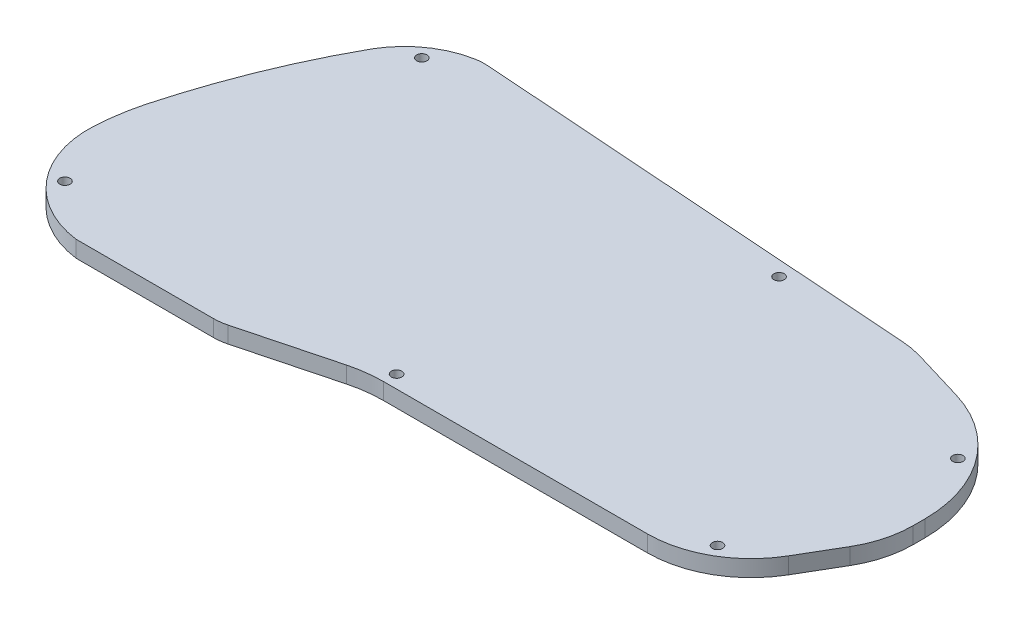
ISO-10303-21;
HEADER;
FILE_DESCRIPTION(('STEP AP214'),'2;1');
FILE_NAME('part.step','',(''),(''),'','','');
FILE_SCHEMA(('AUTOMOTIVE_DESIGN { 1 0 10303 214 1 1 1 1 }'));
ENDSEC;
DATA;
#1=APPLICATION_CONTEXT('core data for automotive mechanical design processes');
#2=APPLICATION_PROTOCOL_DEFINITION('international standard','automotive_design',2000,#1);
#3=PRODUCT_CONTEXT('',#1,'mechanical');
#4=PRODUCT('Part','Part','',(#3));
#5=PRODUCT_RELATED_PRODUCT_CATEGORY('part','',(#4));
#6=PRODUCT_DEFINITION_FORMATION('','',#4);
#7=PRODUCT_DEFINITION_CONTEXT('part definition',#1,'design');
#8=PRODUCT_DEFINITION('design','',#6,#7);
#9=PRODUCT_DEFINITION_SHAPE('','',#8);
#10=(LENGTH_UNIT() NAMED_UNIT(*) SI_UNIT(.MILLI.,.METRE.));
#11=(NAMED_UNIT(*) PLANE_ANGLE_UNIT() SI_UNIT($,.RADIAN.));
#12=(NAMED_UNIT(*) SI_UNIT($,.STERADIAN.) SOLID_ANGLE_UNIT());
#13=UNCERTAINTY_MEASURE_WITH_UNIT(LENGTH_MEASURE(1.E-05),#10,'distance_accuracy_value','');
#14=(GEOMETRIC_REPRESENTATION_CONTEXT(3) GLOBAL_UNCERTAINTY_ASSIGNED_CONTEXT((#13)) GLOBAL_UNIT_ASSIGNED_CONTEXT((#10,
#11,#12)) REPRESENTATION_CONTEXT('',''));
#15=CARTESIAN_POINT('',(0.,0.,0.));
#16=DIRECTION('',(0.,0.,1.));
#17=DIRECTION('',(1.,0.,0.));
#18=AXIS2_PLACEMENT_3D('',#15,#16,#17);
#19=CARTESIAN_POINT('',(-176.887501396103,3.175,27.0431588011881));
#20=DIRECTION('',(0.,1.,0.));
#21=DIRECTION('',(0.,0.,1.));
#22=AXIS2_PLACEMENT_3D('',#19,#20,#21);
#23=PLANE('',#22);
#24=CARTESIAN_POINT('',(-190.160816790515,3.175,37.9709577176414));
#25=DIRECTION('',(0.,1.,0.));
#26=DIRECTION('',(0.,0.,1.));
#27=AXIS2_PLACEMENT_3D('',#24,#25,#26);
#28=CIRCLE('',#27,0.999999999999998);
#29=CARTESIAN_POINT('',(-190.160816790515,3.175,38.9709577176414));
#30=VERTEX_POINT('',#29);
#31=EDGE_CURVE('E464',#30,#30,#28,.T.);
#32=ORIENTED_EDGE('',*,*,#31,.F.);
#33=EDGE_LOOP('',(#32));
#34=FACE_BOUND('',#33,.T.);
#35=CARTESIAN_POINT('',(-105.433568659323,3.175,-14.889534132338));
#36=DIRECTION('',(0.,1.,0.));
#37=DIRECTION('',(0.,0.,1.));
#38=AXIS2_PLACEMENT_3D('',#35,#36,#37);
#39=CIRCLE('',#38,0.999999999999998);
#40=CARTESIAN_POINT('',(-105.433568659323,3.175,-13.889534132338));
#41=VERTEX_POINT('',#40);
#42=EDGE_CURVE('E476',#41,#41,#39,.T.);
#43=ORIENTED_EDGE('',*,*,#42,.F.);
#44=EDGE_LOOP('',(#43));
#45=FACE_BOUND('',#44,.T.);
#46=CARTESIAN_POINT('',(-66.5223487505901,3.175,35.8827361446802));
#47=DIRECTION('',(0.,1.,0.));
#48=DIRECTION('',(0.,0.,1.));
#49=AXIS2_PLACEMENT_3D('',#46,#47,#48);
#50=CIRCLE('',#49,0.999999999999998);
#51=CARTESIAN_POINT('',(-66.5223487505901,3.175,36.8827361446802));
#52=VERTEX_POINT('',#51);
#53=EDGE_CURVE('E338',#52,#52,#50,.T.);
#54=ORIENTED_EDGE('',*,*,#53,.F.);
#55=EDGE_LOOP('',(#54));
#56=FACE_BOUND('',#55,.T.);
#57=CARTESIAN_POINT('',(-176.887501396103,3.175,27.0431588011881));
#58=DIRECTION('',(0.,1.,0.));
#59=DIRECTION('',(0.,0.,1.));
#60=AXIS2_PLACEMENT_3D('',#57,#58,#59);
#61=CIRCLE('',#60,19.6931671994012);
#62=CARTESIAN_POINT('',(-196.548238057197,3.175,25.9134383549433));
#63=VERTEX_POINT('',#62);
#64=CARTESIAN_POINT('',(-179.386599243487,3.175,46.5771124279573));
#65=VERTEX_POINT('',#64);
#66=EDGE_CURVE('E334',#63,#65,#61,.T.);
#67=ORIENTED_EDGE('',*,*,#66,.T.);
#68=DIRECTION('',(1.,0.,0.));
#69=VECTOR('',#68,1.);
#70=CARTESIAN_POINT('',(-179.386599243487,3.175,46.5771124279573));
#71=LINE('',#70,#69);
#72=CARTESIAN_POINT('',(-152.973973641168,3.175,46.5771124279573));
#73=VERTEX_POINT('',#72);
#74=EDGE_CURVE('E126',#65,#73,#71,.T.);
#75=ORIENTED_EDGE('',*,*,#74,.T.);
#76=CARTESIAN_POINT('',(-152.973973641168,3.175,36.5771124279573));
#77=DIRECTION('',(0.,1.,0.));
#78=DIRECTION('',(0.,0.,1.));
#79=AXIS2_PLACEMENT_3D('',#76,#77,#78);
#80=CIRCLE('',#79,9.99999999999999);
#81=CARTESIAN_POINT('',(-150.440219102114,3.175,46.2507925930146));
#82=VERTEX_POINT('',#81);
#83=EDGE_CURVE('E287',#73,#82,#80,.T.);
#84=ORIENTED_EDGE('',*,*,#83,.T.);
#85=DIRECTION('',(0.967368016505734,0.,-0.253375453905388));
#86=VECTOR('',#85,1.);
#87=CARTESIAN_POINT('',(-150.440219102114,3.175,46.2507925930146));
#88=LINE('',#87,#86);
#89=CARTESIAN_POINT('',(-132.369306257302,3.175,41.5176138374486));
#90=VERTEX_POINT('',#89);
#91=EDGE_CURVE('E354',#82,#90,#88,.T.);
#92=ORIENTED_EDGE('',*,*,#91,.T.);
#93=CARTESIAN_POINT('',(-126.034919909668,3.175,65.701814250092));
#94=DIRECTION('',(0.,-1.,0.));
#95=DIRECTION('',(0.,0.,1.));
#96=AXIS2_PLACEMENT_3D('',#93,#94,#95);
#97=CIRCLE('',#96,25.);
#98=CARTESIAN_POINT('',(-126.034919909668,3.175,40.7018142500919));
#99=VERTEX_POINT('',#98);
#100=EDGE_CURVE('E356',#90,#99,#97,.T.);
#101=ORIENTED_EDGE('',*,*,#100,.T.);
#102=DIRECTION('',(1.,0.,0.));
#103=VECTOR('',#102,1.);
#104=CARTESIAN_POINT('',(-126.034919909668,3.175,40.7018142500919));
#105=LINE('',#104,#103);
#106=CARTESIAN_POINT('',(-75.2280716057246,3.175,40.7018142500919));
#107=VERTEX_POINT('',#106);
#108=EDGE_CURVE('E358',#99,#107,#105,.T.);
#109=ORIENTED_EDGE('',*,*,#108,.T.);
#110=CARTESIAN_POINT('',(-75.2280716057246,3.175,20.7018142500919));
#111=DIRECTION('',(0.,1.,0.));
#112=DIRECTION('',(0.,0.,1.));
#113=AXIS2_PLACEMENT_3D('',#110,#111,#112);
#114=CIRCLE('',#113,20.);
#115=CARTESIAN_POINT('',(-57.9662399388212,3.175,30.8027630918342));
#116=VERTEX_POINT('',#115);
#117=EDGE_CURVE('E360',#107,#116,#114,.T.);
#118=ORIENTED_EDGE('',*,*,#117,.T.);
#119=DIRECTION('',(0.505047442087112,0.,-0.863091583345166));
#120=VECTOR('',#119,1.);
#121=CARTESIAN_POINT('',(-57.9662399388212,3.175,30.8027630918342));
#122=LINE('',#121,#120);
#123=CARTESIAN_POINT('',(-53.5819786402493,3.175,23.3103599814533));
#124=VERTEX_POINT('',#123);
#125=EDGE_CURVE('E362',#116,#124,#122,.T.);
#126=ORIENTED_EDGE('',*,*,#125,.T.);
#127=CARTESIAN_POINT('',(-69.9807187238073,3.175,13.714458581798));
#128=DIRECTION('',(0.,1.,0.));
#129=DIRECTION('',(0.,0.,1.));
#130=AXIS2_PLACEMENT_3D('',#127,#128,#129);
#131=CIRCLE('',#130,19.);
#132=CARTESIAN_POINT('',(-50.9807187238073,3.175,13.7144585817979));
#133=VERTEX_POINT('',#132);
#134=EDGE_CURVE('E364',#124,#133,#131,.T.);
#135=ORIENTED_EDGE('',*,*,#134,.T.);
#136=DIRECTION('',(0.,0.,-1.));
#137=VECTOR('',#136,1.);
#138=CARTESIAN_POINT('',(-50.9807187238073,3.175,13.7144585817979));
#139=LINE('',#138,#137);
#140=CARTESIAN_POINT('',(-50.9807187238073,3.175,11.4807206153286));
#141=VERTEX_POINT('',#140);
#142=EDGE_CURVE('E366',#133,#141,#139,.T.);
#143=ORIENTED_EDGE('',*,*,#142,.T.);
#144=CARTESIAN_POINT('',(-75.7101213146076,3.175,11.4807206153286));
#145=DIRECTION('',(0.,1.,0.));
#146=DIRECTION('',(0.,0.,1.));
#147=AXIS2_PLACEMENT_3D('',#144,#145,#146);
#148=CIRCLE('',#147,24.7294025908002);
#149=CARTESIAN_POINT('',(-68.6114430648658,3.175,-12.2079289790345));
#150=VERTEX_POINT('',#149);
#151=EDGE_CURVE('E367',#141,#150,#148,.T.);
#152=ORIENTED_EDGE('',*,*,#151,.T.);
#153=DIRECTION('',(-0.957914349422078,0.,-0.287054174627851));
#154=VECTOR('',#153,1.);
#155=CARTESIAN_POINT('',(-68.6114430648658,3.175,-12.2079289790344));
#156=LINE('',#155,#154);
#157=CARTESIAN_POINT('',(-77.2873572168255,3.175,-14.8078037773767));
#158=VERTEX_POINT('',#157);
#159=EDGE_CURVE('E229',#150,#158,#156,.T.);
#160=ORIENTED_EDGE('',*,*,#159,.T.);
#161=CARTESIAN_POINT('',(-77.2873572168255,3.175,-14.8078037773767));
#162=CARTESIAN_POINT('',(-78.602908240201,3.175,-15.2606179843804));
#163=CARTESIAN_POINT('',(-80.4963343847827,3.175,-15.6623896751234));
#164=CARTESIAN_POINT('',(-81.330596094362,3.175,-15.7967280517116));
#165=CARTESIAN_POINT('',(-81.9124474631906,3.175,-15.8723829859845));
#166=CARTESIAN_POINT('',(-82.2021378739723,3.175,-15.9030949784528));
#167=CARTESIAN_POINT('',(-82.5582741713018,3.175,-15.9393677883881));
#168=CARTESIAN_POINT('',(-82.8699419030708,3.175,-15.9614492051122));
#169=B_SPLINE_CURVE_WITH_KNOTS('',2,(#161,#162,#163,#164,#165,#166,#167,#168),.UNSPECIFIED.,.F.,
.F.,(3,1,1,1,1,1,3),(0.680418274569865,0.836668274569865,0.899168274569865,0.93513949616634,
0.961668274569865,0.96638949616634,1.),.UNSPECIFIED.);
#170=CARTESIAN_POINT('',(-82.8699419030708,3.175,-15.9614492051122));
#171=VERTEX_POINT('',#170);
#172=EDGE_CURVE('E222',#158,#171,#169,.T.);
#173=ORIENTED_EDGE('',*,*,#172,.T.);
#174=DIRECTION('',(-0.997499603118509,0.,-0.0706720721248309));
#175=VECTOR('',#174,1.);
#176=CARTESIAN_POINT('',(-82.8699419030708,3.175,-15.9614492051122));
#177=LINE('',#176,#175);
#178=CARTESIAN_POINT('',(-168.58559921142,3.175,-22.0343369502147));
#179=VERTEX_POINT('',#178);
#180=EDGE_CURVE('E228',#171,#179,#177,.T.);
#181=ORIENTED_EDGE('',*,*,#180,.T.);
#182=CARTESIAN_POINT('',(-169.292319932669,3.175,-12.0593409190296));
#183=DIRECTION('',(0.,1.,0.));
#184=DIRECTION('',(0.,0.,1.));
#185=AXIS2_PLACEMENT_3D('',#182,#183,#184);
#186=CIRCLE('',#185,9.99999999999999);
#187=CARTESIAN_POINT('',(-171.220569819136,3.175,-21.8716725672841));
#188=VERTEX_POINT('',#187);
#189=EDGE_CURVE('E175',#179,#188,#186,.T.);
#190=ORIENTED_EDGE('',*,*,#189,.T.);
#191=CARTESIAN_POINT('',(-167.942545012141,3.175,-5.19070876525153));
#192=DIRECTION('',(0.,1.,0.));
#193=DIRECTION('',(0.,0.,1.));
#194=AXIS2_PLACEMENT_3D('',#191,#192,#193);
#195=CIRCLE('',#194,16.9999999999999);
#196=CARTESIAN_POINT('',(-182.649967907516,3.175,-13.7166522190047));
#197=VERTEX_POINT('',#196);
#198=EDGE_CURVE('E169',#188,#197,#195,.T.);
#199=ORIENTED_EDGE('',*,*,#198,.T.);
#200=CARTESIAN_POINT('',(-182.649967907516,3.175,-13.7166522190045));
#201=CARTESIAN_POINT('',(-184.020157032035,3.175,-11.2666043813432));
#202=CARTESIAN_POINT('',(-186.595532539657,3.175,-6.27098095210053));
#203=CARTESIAN_POINT('',(-189.97373902629,3.175,1.44231799896356));
#204=CARTESIAN_POINT('',(-192.877518679826,3.175,9.36730535737206));
#205=CARTESIAN_POINT('',(-194.495666875214,3.175,14.743968326978));
#206=CARTESIAN_POINT('',(-195.23346346214,3.175,17.4525071102284));
#207=B_SPLINE_CURVE_WITH_KNOTS('',3,(#200,#201,#202,#203,#204,#205,#206),.UNSPECIFIED.,.F.,.F.,
(4,1,1,1,4),(0.255798805589508,0.412929873190249,0.570060940790989,0.72719200839173,
0.88432307599247),.UNSPECIFIED.);
#208=CARTESIAN_POINT('',(-195.23346346214,3.175,17.4525071102284));
#209=VERTEX_POINT('',#208);
#210=EDGE_CURVE('E173',#197,#209,#207,.T.);
#211=ORIENTED_EDGE('',*,*,#210,.T.);
#212=CARTESIAN_POINT('',(-152.307528877601,3.175,28.455542172216));
#213=DIRECTION('',(0.,1.,0.));
#214=DIRECTION('',(0.,0.,1.));
#215=AXIS2_PLACEMENT_3D('',#212,#213,#214);
#216=CIRCLE('',#215,44.3136845740843);
#217=EDGE_CURVE('E53',#209,#63,#216,.T.);
#218=ORIENTED_EDGE('',*,*,#217,.T.);
#219=EDGE_LOOP('',(#67,#75,#84,#92,#101,#109,#118,#126,#135,#143,#152,#160,#173,#181,#190,#199,
#211,#218));
#220=FACE_BOUND('',#219,.T.);
#221=CARTESIAN_POINT('',(-57.8776634191434,3.175,-1.79142257823171));
#222=DIRECTION('',(0.,1.,0.));
#223=DIRECTION('',(0.,0.,1.));
#224=AXIS2_PLACEMENT_3D('',#221,#222,#223);
#225=CIRCLE('',#224,0.999999999999998);
#226=CARTESIAN_POINT('',(-57.8776634191434,3.175,-0.791422578231715));
#227=VERTEX_POINT('',#226);
#228=EDGE_CURVE('E345',#227,#227,#225,.T.);
#229=ORIENTED_EDGE('',*,*,#228,.F.);
#230=EDGE_LOOP('',(#229));
#231=FACE_BOUND('',#230,.T.);
#232=CARTESIAN_POINT('',(-176.364455759612,3.175,-16.9941582340143));
#233=DIRECTION('',(0.,1.,0.));
#234=DIRECTION('',(0.,0.,1.));
#235=AXIS2_PLACEMENT_3D('',#232,#233,#234);
#236=CIRCLE('',#235,0.999999999999998);
#237=CARTESIAN_POINT('',(-176.364455759612,3.175,-15.9941582340143));
#238=VERTEX_POINT('',#237);
#239=EDGE_CURVE('E470',#238,#238,#236,.T.);
#240=ORIENTED_EDGE('',*,*,#239,.F.);
#241=EDGE_LOOP('',(#240));
#242=FACE_BOUND('',#241,.T.);
#243=CARTESIAN_POINT('',(-126.034919909668,3.175,38.2018142500919));
#244=DIRECTION('',(0.,1.,0.));
#245=DIRECTION('',(0.,0.,1.));
#246=AXIS2_PLACEMENT_3D('',#243,#244,#245);
#247=CIRCLE('',#246,0.999999999999998);
#248=CARTESIAN_POINT('',(-126.034919909668,3.175,39.2018142500919));
#249=VERTEX_POINT('',#248);
#250=EDGE_CURVE('E455',#249,#249,#247,.T.);
#251=ORIENTED_EDGE('',*,*,#250,.F.);
#252=EDGE_LOOP('',(#251));
#253=FACE_BOUND('',#252,.T.);
#254=ADVANCED_FACE('F36',(#34,#45,#56,#220,#231,#242,#253),#23,.T.);
#255=CARTESIAN_POINT('',(-176.887501396103,0.,27.0431588011881));
#256=DIRECTION('',(0.,1.,0.));
#257=DIRECTION('',(0.,0.,1.));
#258=AXIS2_PLACEMENT_3D('',#255,#256,#257);
#259=PLANE('',#258);
#260=CARTESIAN_POINT('',(-176.887501396103,0.,27.0431588011881));
#261=DIRECTION('',(0.,1.,0.));
#262=DIRECTION('',(0.,0.,1.));
#263=AXIS2_PLACEMENT_3D('',#260,#261,#262);
#264=CIRCLE('',#263,19.6931671994012);
#265=CARTESIAN_POINT('',(-196.548238057197,0.,25.9134383549433));
#266=VERTEX_POINT('',#265);
#267=CARTESIAN_POINT('',(-179.386599243487,0.,46.5771124279573));
#268=VERTEX_POINT('',#267);
#269=EDGE_CURVE('E299',#266,#268,#264,.T.);
#270=ORIENTED_EDGE('',*,*,#269,.F.);
#271=CARTESIAN_POINT('',(-152.307528877601,0.,28.455542172216));
#272=DIRECTION('',(0.,1.,0.));
#273=DIRECTION('',(0.,0.,1.));
#274=AXIS2_PLACEMENT_3D('',#271,#272,#273);
#275=CIRCLE('',#274,44.3136845740843);
#276=CARTESIAN_POINT('',(-195.23346346214,0.,17.4525071102284));
#277=VERTEX_POINT('',#276);
#278=EDGE_CURVE('E118',#277,#266,#275,.T.);
#279=ORIENTED_EDGE('',*,*,#278,.F.);
#280=CARTESIAN_POINT('',(-182.649967907516,0.,-13.7166522190045));
#281=CARTESIAN_POINT('',(-184.020157032035,0.,-11.2666043813432));
#282=CARTESIAN_POINT('',(-186.595532539657,0.,-6.27098095210053));
#283=CARTESIAN_POINT('',(-189.97373902629,0.,1.44231799896356));
#284=CARTESIAN_POINT('',(-192.877518679826,0.,9.36730535737206));
#285=CARTESIAN_POINT('',(-194.495666875214,0.,14.743968326978));
#286=CARTESIAN_POINT('',(-195.23346346214,0.,17.4525071102284));
#287=B_SPLINE_CURVE_WITH_KNOTS('',3,(#280,#281,#282,#283,#284,#285,#286),.UNSPECIFIED.,.F.,.F.,
(4,1,1,1,4),(0.255798805589508,0.412929873190249,0.570060940790989,0.72719200839173,
0.88432307599247),.UNSPECIFIED.);
#288=CARTESIAN_POINT('',(-182.649967907516,0.,-13.7166522190047));
#289=VERTEX_POINT('',#288);
#290=EDGE_CURVE('E112',#289,#277,#287,.T.);
#291=ORIENTED_EDGE('',*,*,#290,.F.);
#292=CARTESIAN_POINT('',(-167.942545012141,0.,-5.19070876525153));
#293=DIRECTION('',(0.,1.,0.));
#294=DIRECTION('',(0.,0.,1.));
#295=AXIS2_PLACEMENT_3D('',#292,#293,#294);
#296=CIRCLE('',#295,16.9999999999999);
#297=CARTESIAN_POINT('',(-171.220569819136,0.,-21.8716725672841));
#298=VERTEX_POINT('',#297);
#299=EDGE_CURVE('E183',#298,#289,#296,.T.);
#300=ORIENTED_EDGE('',*,*,#299,.F.);
#301=CARTESIAN_POINT('',(-169.292319932669,0.,-12.0593409190296));
#302=DIRECTION('',(0.,1.,0.));
#303=DIRECTION('',(0.,0.,1.));
#304=AXIS2_PLACEMENT_3D('',#301,#302,#303);
#305=CIRCLE('',#304,9.99999999999999);
#306=CARTESIAN_POINT('',(-168.58559921142,0.,-22.0343369502147));
#307=VERTEX_POINT('',#306);
#308=EDGE_CURVE('E246',#307,#298,#305,.T.);
#309=ORIENTED_EDGE('',*,*,#308,.F.);
#310=DIRECTION('',(-0.997499603118509,0.,-0.0706720721248309));
#311=VECTOR('',#310,1.);
#312=CARTESIAN_POINT('',(-82.8699419030708,0.,-15.9614492051122));
#313=LINE('',#312,#311);
#314=CARTESIAN_POINT('',(-82.8699419030708,0.,-15.9614492051122));
#315=VERTEX_POINT('',#314);
#316=EDGE_CURVE('E242',#315,#307,#313,.T.);
#317=ORIENTED_EDGE('',*,*,#316,.F.);
#318=CARTESIAN_POINT('',(-77.2873572168255,0.,-14.8078037773767));
#319=CARTESIAN_POINT('',(-78.602908240201,0.,-15.2606179843804));
#320=CARTESIAN_POINT('',(-80.4963343847827,0.,-15.6623896751234));
#321=CARTESIAN_POINT('',(-81.330596094362,0.,-15.7967280517116));
#322=CARTESIAN_POINT('',(-81.9124474631906,0.,-15.8723829859845));
#323=CARTESIAN_POINT('',(-82.2021378739723,0.,-15.9030949784528));
#324=CARTESIAN_POINT('',(-82.5582741713018,0.,-15.9393677883881));
#325=CARTESIAN_POINT('',(-82.8699419030708,0.,-15.9614492051122));
#326=B_SPLINE_CURVE_WITH_KNOTS('',2,(#318,#319,#320,#321,#322,#323,#324,#325),.UNSPECIFIED.,.F.,
.F.,(3,1,1,1,1,1,3),(0.680418274569865,0.836668274569865,0.899168274569865,0.93513949616634,
0.961668274569865,0.96638949616634,1.),.UNSPECIFIED.);
#327=CARTESIAN_POINT('',(-77.2873572168255,0.,-14.8078037773767));
#328=VERTEX_POINT('',#327);
#329=EDGE_CURVE('E317',#328,#315,#326,.T.);
#330=ORIENTED_EDGE('',*,*,#329,.F.);
#331=DIRECTION('',(-0.957914349422078,0.,-0.287054174627851));
#332=VECTOR('',#331,1.);
#333=CARTESIAN_POINT('',(-68.6114430648658,0.,-12.2079289790344));
#334=LINE('',#333,#332);
#335=CARTESIAN_POINT('',(-68.6114430648658,0.,-12.2079289790345));
#336=VERTEX_POINT('',#335);
#337=EDGE_CURVE('E315',#336,#328,#334,.T.);
#338=ORIENTED_EDGE('',*,*,#337,.F.);
#339=CARTESIAN_POINT('',(-75.7101213146076,0.,11.4807206153286));
#340=DIRECTION('',(0.,1.,0.));
#341=DIRECTION('',(0.,0.,1.));
#342=AXIS2_PLACEMENT_3D('',#339,#340,#341);
#343=CIRCLE('',#342,24.7294025908002);
#344=CARTESIAN_POINT('',(-50.9807187238073,0.,11.4807206153286));
#345=VERTEX_POINT('',#344);
#346=EDGE_CURVE('E313',#345,#336,#343,.T.);
#347=ORIENTED_EDGE('',*,*,#346,.F.);
#348=DIRECTION('',(0.,0.,-1.));
#349=VECTOR('',#348,1.);
#350=CARTESIAN_POINT('',(-50.9807187238073,0.,13.7144585817979));
#351=LINE('',#350,#349);
#352=CARTESIAN_POINT('',(-50.9807187238073,0.,13.7144585817979));
#353=VERTEX_POINT('',#352);
#354=EDGE_CURVE('E311',#353,#345,#351,.T.);
#355=ORIENTED_EDGE('',*,*,#354,.F.);
#356=CARTESIAN_POINT('',(-69.9807187238073,0.,13.714458581798));
#357=DIRECTION('',(0.,1.,0.));
#358=DIRECTION('',(0.,0.,1.));
#359=AXIS2_PLACEMENT_3D('',#356,#357,#358);
#360=CIRCLE('',#359,19.);
#361=CARTESIAN_POINT('',(-53.5819786402493,0.,23.3103599814533));
#362=VERTEX_POINT('',#361);
#363=EDGE_CURVE('E309',#362,#353,#360,.T.);
#364=ORIENTED_EDGE('',*,*,#363,.F.);
#365=DIRECTION('',(0.505047442087112,0.,-0.863091583345166));
#366=VECTOR('',#365,1.);
#367=CARTESIAN_POINT('',(-57.9662399388212,0.,30.8027630918342));
#368=LINE('',#367,#366);
#369=CARTESIAN_POINT('',(-57.9662399388212,0.,30.8027630918342));
#370=VERTEX_POINT('',#369);
#371=EDGE_CURVE('E307',#370,#362,#368,.T.);
#372=ORIENTED_EDGE('',*,*,#371,.F.);
#373=CARTESIAN_POINT('',(-75.2280716057246,0.,20.7018142500919));
#374=DIRECTION('',(0.,1.,0.));
#375=DIRECTION('',(0.,0.,1.));
#376=AXIS2_PLACEMENT_3D('',#373,#374,#375);
#377=CIRCLE('',#376,20.);
#378=CARTESIAN_POINT('',(-75.2280716057246,0.,40.7018142500919));
#379=VERTEX_POINT('',#378);
#380=EDGE_CURVE('E305',#379,#370,#377,.T.);
#381=ORIENTED_EDGE('',*,*,#380,.F.);
#382=DIRECTION('',(1.,0.,0.));
#383=VECTOR('',#382,1.);
#384=CARTESIAN_POINT('',(-126.034919909668,0.,40.7018142500919));
#385=LINE('',#384,#383);
#386=CARTESIAN_POINT('',(-126.034919909668,0.,40.7018142500919));
#387=VERTEX_POINT('',#386);
#388=EDGE_CURVE('E303',#387,#379,#385,.T.);
#389=ORIENTED_EDGE('',*,*,#388,.F.);
#390=CARTESIAN_POINT('',(-126.034919909668,0.,65.701814250092));
#391=DIRECTION('',(0.,-1.,0.));
#392=DIRECTION('',(0.,0.,1.));
#393=AXIS2_PLACEMENT_3D('',#390,#391,#392);
#394=CIRCLE('',#393,25.);
#395=CARTESIAN_POINT('',(-132.369306257302,0.,41.5176138374486));
#396=VERTEX_POINT('',#395);
#397=EDGE_CURVE('E297',#396,#387,#394,.T.);
#398=ORIENTED_EDGE('',*,*,#397,.F.);
#399=DIRECTION('',(0.967368016505734,0.,-0.253375453905388));
#400=VECTOR('',#399,1.);
#401=CARTESIAN_POINT('',(-150.440219102114,0.,46.2507925930146));
#402=LINE('',#401,#400);
#403=CARTESIAN_POINT('',(-150.440219102114,0.,46.2507925930146));
#404=VERTEX_POINT('',#403);
#405=EDGE_CURVE('E295',#404,#396,#402,.T.);
#406=ORIENTED_EDGE('',*,*,#405,.F.);
#407=CARTESIAN_POINT('',(-152.973973641168,0.,36.5771124279573));
#408=DIRECTION('',(0.,1.,0.));
#409=DIRECTION('',(0.,0.,1.));
#410=AXIS2_PLACEMENT_3D('',#407,#408,#409);
#411=CIRCLE('',#410,9.99999999999999);
#412=CARTESIAN_POINT('',(-152.973973641168,0.,46.5771124279573));
#413=VERTEX_POINT('',#412);
#414=EDGE_CURVE('E286',#413,#404,#411,.T.);
#415=ORIENTED_EDGE('',*,*,#414,.F.);
#416=DIRECTION('',(1.,0.,0.));
#417=VECTOR('',#416,1.);
#418=CARTESIAN_POINT('',(-179.386599243487,0.,46.5771124279573));
#419=LINE('',#418,#417);
#420=EDGE_CURVE('E293',#268,#413,#419,.T.);
#421=ORIENTED_EDGE('',*,*,#420,.F.);
#422=EDGE_LOOP('',(#270,#279,#291,#300,#309,#317,#330,#338,#347,#355,#364,#372,#381,#389,#398,
#406,#415,#421));
#423=FACE_BOUND('',#422,.T.);
#424=CARTESIAN_POINT('',(-66.5223487505901,0.,35.8827361446802));
#425=DIRECTION('',(0.,1.,0.));
#426=DIRECTION('',(0.,0.,1.));
#427=AXIS2_PLACEMENT_3D('',#424,#425,#426);
#428=CIRCLE('',#427,0.999999999999998);
#429=CARTESIAN_POINT('',(-66.5223487505901,0.,36.8827361446802));
#430=VERTEX_POINT('',#429);
#431=EDGE_CURVE('E340',#430,#430,#428,.T.);
#432=ORIENTED_EDGE('',*,*,#431,.T.);
#433=EDGE_LOOP('',(#432));
#434=FACE_BOUND('',#433,.T.);
#435=CARTESIAN_POINT('',(-57.8776634191434,0.,-1.79142257823171));
#436=DIRECTION('',(0.,1.,0.));
#437=DIRECTION('',(0.,0.,1.));
#438=AXIS2_PLACEMENT_3D('',#435,#436,#437);
#439=CIRCLE('',#438,0.999999999999998);
#440=CARTESIAN_POINT('',(-57.8776634191434,0.,-0.791422578231715));
#441=VERTEX_POINT('',#440);
#442=EDGE_CURVE('E348',#441,#441,#439,.T.);
#443=ORIENTED_EDGE('',*,*,#442,.T.);
#444=EDGE_LOOP('',(#443));
#445=FACE_BOUND('',#444,.T.);
#446=CARTESIAN_POINT('',(-105.433568659323,0.,-14.889534132338));
#447=DIRECTION('',(0.,1.,0.));
#448=DIRECTION('',(0.,0.,1.));
#449=AXIS2_PLACEMENT_3D('',#446,#447,#448);
#450=CIRCLE('',#449,0.999999999999998);
#451=CARTESIAN_POINT('',(-105.433568659323,0.,-13.889534132338));
#452=VERTEX_POINT('',#451);
#453=EDGE_CURVE('E473',#452,#452,#450,.T.);
#454=ORIENTED_EDGE('',*,*,#453,.T.);
#455=EDGE_LOOP('',(#454));
#456=FACE_BOUND('',#455,.T.);
#457=CARTESIAN_POINT('',(-176.364455759612,0.,-16.9941582340143));
#458=DIRECTION('',(0.,1.,0.));
#459=DIRECTION('',(0.,0.,1.));
#460=AXIS2_PLACEMENT_3D('',#457,#458,#459);
#461=CIRCLE('',#460,0.999999999999998);
#462=CARTESIAN_POINT('',(-176.364455759612,0.,-15.9941582340143));
#463=VERTEX_POINT('',#462);
#464=EDGE_CURVE('E467',#463,#463,#461,.T.);
#465=ORIENTED_EDGE('',*,*,#464,.T.);
#466=EDGE_LOOP('',(#465));
#467=FACE_BOUND('',#466,.T.);
#468=CARTESIAN_POINT('',(-190.160816790515,0.,37.9709577176414));
#469=DIRECTION('',(0.,1.,0.));
#470=DIRECTION('',(0.,0.,1.));
#471=AXIS2_PLACEMENT_3D('',#468,#469,#470);
#472=CIRCLE('',#471,0.999999999999998);
#473=CARTESIAN_POINT('',(-190.160816790515,0.,38.9709577176414));
#474=VERTEX_POINT('',#473);
#475=EDGE_CURVE('E461',#474,#474,#472,.T.);
#476=ORIENTED_EDGE('',*,*,#475,.T.);
#477=EDGE_LOOP('',(#476));
#478=FACE_BOUND('',#477,.T.);
#479=CARTESIAN_POINT('',(-126.034919909668,0.,38.2018142500919));
#480=DIRECTION('',(0.,1.,0.));
#481=DIRECTION('',(0.,0.,1.));
#482=AXIS2_PLACEMENT_3D('',#479,#480,#481);
#483=CIRCLE('',#482,0.999999999999998);
#484=CARTESIAN_POINT('',(-126.034919909668,0.,39.2018142500919));
#485=VERTEX_POINT('',#484);
#486=EDGE_CURVE('E458',#485,#485,#483,.T.);
#487=ORIENTED_EDGE('',*,*,#486,.T.);
#488=EDGE_LOOP('',(#487));
#489=FACE_BOUND('',#488,.T.);
#490=ADVANCED_FACE('F291',(#423,#434,#445,#456,#467,#478,#489),#259,.F.);
#491=CARTESIAN_POINT('',(-176.887501396103,3.175,27.0431588011881));
#492=DIRECTION('',(0.,-1.,0.));
#493=DIRECTION('',(0.,0.,-1.));
#494=AXIS2_PLACEMENT_3D('',#491,#492,#493);
#495=CYLINDRICAL_SURFACE('',#494,19.6931671994012);
#496=ORIENTED_EDGE('',*,*,#269,.T.);
#497=DIRECTION('',(0.,-1.,0.));
#498=VECTOR('',#497,1.);
#499=CARTESIAN_POINT('',(-179.386599243487,3.175,46.5771124279573));
#500=LINE('',#499,#498);
#501=EDGE_CURVE('E11',#65,#268,#500,.T.);
#502=ORIENTED_EDGE('',*,*,#501,.F.);
#503=ORIENTED_EDGE('',*,*,#66,.F.);
#504=DIRECTION('',(0.,-1.,0.));
#505=VECTOR('',#504,1.);
#506=CARTESIAN_POINT('',(-196.548238057197,3.175,25.9134383549433));
#507=LINE('',#506,#505);
#508=EDGE_CURVE('E189',#63,#266,#507,.T.);
#509=ORIENTED_EDGE('',*,*,#508,.T.);
#510=EDGE_LOOP('',(#496,#502,#503,#509));
#511=FACE_BOUND('',#510,.T.);
#512=ADVANCED_FACE('F38',(#511),#495,.T.);
#513=CARTESIAN_POINT('',(-179.386599243487,3.175,46.5771124279573));
#514=DIRECTION('',(0.,0.,-1.));
#515=DIRECTION('',(-1.,0.,0.));
#516=AXIS2_PLACEMENT_3D('',#513,#514,#515);
#517=PLANE('',#516);
#518=ORIENTED_EDGE('',*,*,#420,.T.);
#519=DIRECTION('',(0.,-1.,0.));
#520=VECTOR('',#519,1.);
#521=CARTESIAN_POINT('',(-152.973973641168,3.175,46.5771124279573));
#522=LINE('',#521,#520);
#523=EDGE_CURVE('E45',#73,#413,#522,.T.);
#524=ORIENTED_EDGE('',*,*,#523,.F.);
#525=ORIENTED_EDGE('',*,*,#74,.F.);
#526=ORIENTED_EDGE('',*,*,#501,.T.);
#527=EDGE_LOOP('',(#518,#524,#525,#526));
#528=FACE_BOUND('',#527,.T.);
#529=ADVANCED_FACE('F412',(#528),#517,.F.);
#530=CARTESIAN_POINT('',(-152.973973641168,3.175,36.5771124279573));
#531=DIRECTION('',(0.,-1.,0.));
#532=DIRECTION('',(0.,0.,-1.));
#533=AXIS2_PLACEMENT_3D('',#530,#531,#532);
#534=CYLINDRICAL_SURFACE('',#533,9.99999999999999);
#535=ORIENTED_EDGE('',*,*,#414,.T.);
#536=DIRECTION('',(0.,-1.,0.));
#537=VECTOR('',#536,1.);
#538=CARTESIAN_POINT('',(-150.440219102114,3.175,46.2507925930146));
#539=LINE('',#538,#537);
#540=EDGE_CURVE('E278',#82,#404,#539,.T.);
#541=ORIENTED_EDGE('',*,*,#540,.F.);
#542=ORIENTED_EDGE('',*,*,#83,.F.);
#543=ORIENTED_EDGE('',*,*,#523,.T.);
#544=EDGE_LOOP('',(#535,#541,#542,#543));
#545=FACE_BOUND('',#544,.T.);
#546=ADVANCED_FACE('F284',(#545),#534,.T.);
#547=CARTESIAN_POINT('',(-150.440219102114,3.175,46.2507925930146));
#548=DIRECTION('',(-0.253375453905388,0.,-0.967368016505734));
#549=DIRECTION('',(-0.967368016505734,0.,0.253375453905388));
#550=AXIS2_PLACEMENT_3D('',#547,#548,#549);
#551=PLANE('',#550);
#552=ORIENTED_EDGE('',*,*,#405,.T.);
#553=DIRECTION('',(0.,-1.,0.));
#554=VECTOR('',#553,1.);
#555=CARTESIAN_POINT('',(-132.369306257302,3.175,41.5176138374486));
#556=LINE('',#555,#554);
#557=EDGE_CURVE('E275',#90,#396,#556,.T.);
#558=ORIENTED_EDGE('',*,*,#557,.F.);
#559=ORIENTED_EDGE('',*,*,#91,.F.);
#560=ORIENTED_EDGE('',*,*,#540,.T.);
#561=EDGE_LOOP('',(#552,#558,#559,#560));
#562=FACE_BOUND('',#561,.T.);
#563=ADVANCED_FACE('F410',(#562),#551,.F.);
#564=CARTESIAN_POINT('',(-126.034919909668,3.175,65.701814250092));
#565=DIRECTION('',(0.,-1.,0.));
#566=DIRECTION('',(0.,0.,-1.));
#567=AXIS2_PLACEMENT_3D('',#564,#565,#566);
#568=CYLINDRICAL_SURFACE('',#567,25.);
#569=ORIENTED_EDGE('',*,*,#397,.T.);
#570=DIRECTION('',(0.,-1.,0.));
#571=VECTOR('',#570,1.);
#572=CARTESIAN_POINT('',(-126.034919909668,3.175,40.7018142500919));
#573=LINE('',#572,#571);
#574=EDGE_CURVE('E272',#99,#387,#573,.T.);
#575=ORIENTED_EDGE('',*,*,#574,.F.);
#576=ORIENTED_EDGE('',*,*,#100,.F.);
#577=ORIENTED_EDGE('',*,*,#557,.T.);
#578=EDGE_LOOP('',(#569,#575,#576,#577));
#579=FACE_BOUND('',#578,.T.);
#580=ADVANCED_FACE('F405',(#579),#568,.F.);
#581=CARTESIAN_POINT('',(-126.034919909668,3.175,40.7018142500919));
#582=DIRECTION('',(0.,0.,-1.));
#583=DIRECTION('',(-1.,0.,0.));
#584=AXIS2_PLACEMENT_3D('',#581,#582,#583);
#585=PLANE('',#584);
#586=ORIENTED_EDGE('',*,*,#388,.T.);
#587=DIRECTION('',(0.,-1.,0.));
#588=VECTOR('',#587,1.);
#589=CARTESIAN_POINT('',(-75.2280716057246,3.175,40.7018142500919));
#590=LINE('',#589,#588);
#591=EDGE_CURVE('E269',#107,#379,#590,.T.);
#592=ORIENTED_EDGE('',*,*,#591,.F.);
#593=ORIENTED_EDGE('',*,*,#108,.F.);
#594=ORIENTED_EDGE('',*,*,#574,.T.);
#595=EDGE_LOOP('',(#586,#592,#593,#594));
#596=FACE_BOUND('',#595,.T.);
#597=ADVANCED_FACE('F402',(#596),#585,.F.);
#598=CARTESIAN_POINT('',(-75.2280716057246,3.175,20.7018142500919));
#599=DIRECTION('',(0.,-1.,0.));
#600=DIRECTION('',(0.,0.,-1.));
#601=AXIS2_PLACEMENT_3D('',#598,#599,#600);
#602=CYLINDRICAL_SURFACE('',#601,20.);
#603=ORIENTED_EDGE('',*,*,#380,.T.);
#604=DIRECTION('',(0.,-1.,0.));
#605=VECTOR('',#604,1.);
#606=CARTESIAN_POINT('',(-57.9662399388212,3.175,30.8027630918342));
#607=LINE('',#606,#605);
#608=EDGE_CURVE('E266',#116,#370,#607,.T.);
#609=ORIENTED_EDGE('',*,*,#608,.F.);
#610=ORIENTED_EDGE('',*,*,#117,.F.);
#611=ORIENTED_EDGE('',*,*,#591,.T.);
#612=EDGE_LOOP('',(#603,#609,#610,#611));
#613=FACE_BOUND('',#612,.T.);
#614=ADVANCED_FACE('F398',(#613),#602,.T.);
#615=CARTESIAN_POINT('',(-57.9662399388212,3.175,30.8027630918342));
#616=DIRECTION('',(-0.863091583345166,0.,-0.505047442087112));
#617=DIRECTION('',(-0.505047442087112,0.,0.863091583345166));
#618=AXIS2_PLACEMENT_3D('',#615,#616,#617);
#619=PLANE('',#618);
#620=ORIENTED_EDGE('',*,*,#371,.T.);
#621=DIRECTION('',(0.,-1.,0.));
#622=VECTOR('',#621,1.);
#623=CARTESIAN_POINT('',(-53.5819786402493,3.175,23.3103599814533));
#624=LINE('',#623,#622);
#625=EDGE_CURVE('E263',#124,#362,#624,.T.);
#626=ORIENTED_EDGE('',*,*,#625,.F.);
#627=ORIENTED_EDGE('',*,*,#125,.F.);
#628=ORIENTED_EDGE('',*,*,#608,.T.);
#629=EDGE_LOOP('',(#620,#626,#627,#628));
#630=FACE_BOUND('',#629,.T.);
#631=ADVANCED_FACE('F393',(#630),#619,.F.);
#632=CARTESIAN_POINT('',(-69.9807187238073,3.175,13.714458581798));
#633=DIRECTION('',(0.,-1.,0.));
#634=DIRECTION('',(0.,0.,-1.));
#635=AXIS2_PLACEMENT_3D('',#632,#633,#634);
#636=CYLINDRICAL_SURFACE('',#635,19.);
#637=ORIENTED_EDGE('',*,*,#363,.T.);
#638=DIRECTION('',(0.,-1.,0.));
#639=VECTOR('',#638,1.);
#640=CARTESIAN_POINT('',(-50.9807187238073,3.175,13.7144585817979));
#641=LINE('',#640,#639);
#642=EDGE_CURVE('E260',#133,#353,#641,.T.);
#643=ORIENTED_EDGE('',*,*,#642,.F.);
#644=ORIENTED_EDGE('',*,*,#134,.F.);
#645=ORIENTED_EDGE('',*,*,#625,.T.);
#646=EDGE_LOOP('',(#637,#643,#644,#645));
#647=FACE_BOUND('',#646,.T.);
#648=ADVANCED_FACE('F387',(#647),#636,.T.);
#649=CARTESIAN_POINT('',(-50.9807187238073,3.175,13.7144585817979));
#650=DIRECTION('',(-1.,0.,0.));
#651=DIRECTION('',(0.,0.,1.));
#652=AXIS2_PLACEMENT_3D('',#649,#650,#651);
#653=PLANE('',#652);
#654=ORIENTED_EDGE('',*,*,#354,.T.);
#655=DIRECTION('',(0.,-1.,0.));
#656=VECTOR('',#655,1.);
#657=CARTESIAN_POINT('',(-50.9807187238073,3.175,11.4807206153286));
#658=LINE('',#657,#656);
#659=EDGE_CURVE('E257',#141,#345,#658,.T.);
#660=ORIENTED_EDGE('',*,*,#659,.F.);
#661=ORIENTED_EDGE('',*,*,#142,.F.);
#662=ORIENTED_EDGE('',*,*,#642,.T.);
#663=EDGE_LOOP('',(#654,#660,#661,#662));
#664=FACE_BOUND('',#663,.T.);
#665=ADVANCED_FACE('F383',(#664),#653,.F.);
#666=CARTESIAN_POINT('',(-75.7101213146076,3.175,11.4807206153286));
#667=DIRECTION('',(0.,-1.,0.));
#668=DIRECTION('',(0.,0.,-1.));
#669=AXIS2_PLACEMENT_3D('',#666,#667,#668);
#670=CYLINDRICAL_SURFACE('',#669,24.7294025908002);
#671=ORIENTED_EDGE('',*,*,#346,.T.);
#672=DIRECTION('',(0.,-1.,0.));
#673=VECTOR('',#672,1.);
#674=CARTESIAN_POINT('',(-68.6114430648658,3.175,-12.2079289790345));
#675=LINE('',#674,#673);
#676=EDGE_CURVE('E254',#150,#336,#675,.T.);
#677=ORIENTED_EDGE('',*,*,#676,.F.);
#678=ORIENTED_EDGE('',*,*,#151,.F.);
#679=ORIENTED_EDGE('',*,*,#659,.T.);
#680=EDGE_LOOP('',(#671,#677,#678,#679));
#681=FACE_BOUND('',#680,.T.);
#682=ADVANCED_FACE('F379',(#681),#670,.T.);
#683=CARTESIAN_POINT('',(-68.6114430648658,3.175,-12.2079289790344));
#684=DIRECTION('',(-0.287054174627851,0.,0.957914349422078));
#685=DIRECTION('',(0.957914349422078,0.,0.287054174627851));
#686=AXIS2_PLACEMENT_3D('',#683,#684,#685);
#687=PLANE('',#686);
#688=ORIENTED_EDGE('',*,*,#337,.T.);
#689=DIRECTION('',(0.,-1.,0.));
#690=VECTOR('',#689,1.);
#691=CARTESIAN_POINT('',(-77.2873572168255,3.175,-14.8078037773767));
#692=LINE('',#691,#690);
#693=EDGE_CURVE('E251',#158,#328,#692,.T.);
#694=ORIENTED_EDGE('',*,*,#693,.F.);
#695=ORIENTED_EDGE('',*,*,#159,.F.);
#696=ORIENTED_EDGE('',*,*,#676,.T.);
#697=EDGE_LOOP('',(#688,#694,#695,#696));
#698=FACE_BOUND('',#697,.T.);
#699=ADVANCED_FACE('F219',(#698),#687,.F.);
#700=DIRECTION('',(0.,-1.,0.));
#701=VECTOR('',#700,1.);
#702=SURFACE_OF_LINEAR_EXTRUSION('',#169,#701);
#703=ORIENTED_EDGE('',*,*,#329,.T.);
#704=DIRECTION('',(0.,-1.,0.));
#705=VECTOR('',#704,1.);
#706=CARTESIAN_POINT('',(-82.8699419030708,3.175,-15.9614492051122));
#707=LINE('',#706,#705);
#708=EDGE_CURVE('E244',#171,#315,#707,.T.);
#709=ORIENTED_EDGE('',*,*,#708,.F.);
#710=ORIENTED_EDGE('',*,*,#172,.F.);
#711=ORIENTED_EDGE('',*,*,#693,.T.);
#712=EDGE_LOOP('',(#703,#709,#710,#711));
#713=FACE_BOUND('',#712,.T.);
#714=ADVANCED_FACE('F214',(#713),#702,.F.);
#715=CARTESIAN_POINT('',(-82.8699419030708,3.175,-15.9614492051122));
#716=DIRECTION('',(-0.0706720721248309,0.,0.997499603118509));
#717=DIRECTION('',(0.997499603118509,0.,0.0706720721248309));
#718=AXIS2_PLACEMENT_3D('',#715,#716,#717);
#719=PLANE('',#718);
#720=ORIENTED_EDGE('',*,*,#316,.T.);
#721=DIRECTION('',(0.,-1.,0.));
#722=VECTOR('',#721,1.);
#723=CARTESIAN_POINT('',(-168.58559921142,3.175,-22.0343369502147));
#724=LINE('',#723,#722);
#725=EDGE_CURVE('E240',#179,#307,#724,.T.);
#726=ORIENTED_EDGE('',*,*,#725,.F.);
#727=ORIENTED_EDGE('',*,*,#180,.F.);
#728=ORIENTED_EDGE('',*,*,#708,.T.);
#729=EDGE_LOOP('',(#720,#726,#727,#728));
#730=FACE_BOUND('',#729,.T.);
#731=ADVANCED_FACE('F210',(#730),#719,.F.);
#732=CARTESIAN_POINT('',(-169.292319932669,3.175,-12.0593409190296));
#733=DIRECTION('',(0.,-1.,0.));
#734=DIRECTION('',(0.,0.,-1.));
#735=AXIS2_PLACEMENT_3D('',#732,#733,#734);
#736=CYLINDRICAL_SURFACE('',#735,9.99999999999999);
#737=ORIENTED_EDGE('',*,*,#308,.T.);
#738=DIRECTION('',(0.,-1.,0.));
#739=VECTOR('',#738,1.);
#740=CARTESIAN_POINT('',(-171.220569819136,3.175,-21.8716725672841));
#741=LINE('',#740,#739);
#742=EDGE_CURVE('E184',#188,#298,#741,.T.);
#743=ORIENTED_EDGE('',*,*,#742,.F.);
#744=ORIENTED_EDGE('',*,*,#189,.F.);
#745=ORIENTED_EDGE('',*,*,#725,.T.);
#746=EDGE_LOOP('',(#737,#743,#744,#745));
#747=FACE_BOUND('',#746,.T.);
#748=ADVANCED_FACE('F207',(#747),#736,.T.);
#749=CARTESIAN_POINT('',(-167.942545012141,3.175,-5.19070876525153));
#750=DIRECTION('',(0.,-1.,0.));
#751=DIRECTION('',(0.,0.,-1.));
#752=AXIS2_PLACEMENT_3D('',#749,#750,#751);
#753=CYLINDRICAL_SURFACE('',#752,16.9999999999999);
#754=ORIENTED_EDGE('',*,*,#299,.T.);
#755=DIRECTION('',(0.,-1.,0.));
#756=VECTOR('',#755,1.);
#757=CARTESIAN_POINT('',(-182.649967907516,3.175,-13.7166522190047));
#758=LINE('',#757,#756);
#759=EDGE_CURVE('E180',#197,#289,#758,.T.);
#760=ORIENTED_EDGE('',*,*,#759,.F.);
#761=ORIENTED_EDGE('',*,*,#198,.F.);
#762=ORIENTED_EDGE('',*,*,#742,.T.);
#763=EDGE_LOOP('',(#754,#760,#761,#762));
#764=FACE_BOUND('',#763,.T.);
#765=ADVANCED_FACE('F181',(#764),#753,.T.);
#766=DIRECTION('',(0.,-1.,0.));
#767=VECTOR('',#766,1.);
#768=SURFACE_OF_LINEAR_EXTRUSION('',#207,#767);
#769=ORIENTED_EDGE('',*,*,#290,.T.);
#770=DIRECTION('',(0.,-1.,0.));
#771=VECTOR('',#770,1.);
#772=CARTESIAN_POINT('',(-195.23346346214,3.175,17.4525071102284));
#773=LINE('',#772,#771);
#774=EDGE_CURVE('E185',#209,#277,#773,.T.);
#775=ORIENTED_EDGE('',*,*,#774,.F.);
#776=ORIENTED_EDGE('',*,*,#210,.F.);
#777=ORIENTED_EDGE('',*,*,#759,.T.);
#778=EDGE_LOOP('',(#769,#775,#776,#777));
#779=FACE_BOUND('',#778,.T.);
#780=ADVANCED_FACE('F187',(#779),#768,.F.);
#781=CARTESIAN_POINT('',(-152.307528877601,3.175,28.455542172216));
#782=DIRECTION('',(0.,-1.,0.));
#783=DIRECTION('',(0.,0.,-1.));
#784=AXIS2_PLACEMENT_3D('',#781,#782,#783);
#785=CYLINDRICAL_SURFACE('',#784,44.3136845740843);
#786=ORIENTED_EDGE('',*,*,#278,.T.);
#787=ORIENTED_EDGE('',*,*,#508,.F.);
#788=ORIENTED_EDGE('',*,*,#217,.F.);
#789=ORIENTED_EDGE('',*,*,#774,.T.);
#790=EDGE_LOOP('',(#786,#787,#788,#789));
#791=FACE_BOUND('',#790,.T.);
#792=ADVANCED_FACE('F203',(#791),#785,.T.);
#793=CARTESIAN_POINT('',(-66.5223487505901,3.175,35.8827361446802));
#794=DIRECTION('',(0.,-1.,0.));
#795=DIRECTION('',(0.,0.,-1.));
#796=AXIS2_PLACEMENT_3D('',#793,#794,#795);
#797=CYLINDRICAL_SURFACE('',#796,0.999999999999998);
#798=ORIENTED_EDGE('',*,*,#53,.T.);
#799=EDGE_LOOP('',(#798));
#800=FACE_BOUND('',#799,.T.);
#801=ORIENTED_EDGE('',*,*,#431,.F.);
#802=EDGE_LOOP('',(#801));
#803=FACE_BOUND('',#802,.T.);
#804=ADVANCED_FACE('F428',(#800,#803),#797,.F.);
#805=CARTESIAN_POINT('',(-57.8776634191434,3.175,-1.79142257823171));
#806=DIRECTION('',(0.,-1.,0.));
#807=DIRECTION('',(0.,0.,-1.));
#808=AXIS2_PLACEMENT_3D('',#805,#806,#807);
#809=CYLINDRICAL_SURFACE('',#808,0.999999999999998);
#810=ORIENTED_EDGE('',*,*,#228,.T.);
#811=EDGE_LOOP('',(#810));
#812=FACE_BOUND('',#811,.T.);
#813=ORIENTED_EDGE('',*,*,#442,.F.);
#814=EDGE_LOOP('',(#813));
#815=FACE_BOUND('',#814,.T.);
#816=ADVANCED_FACE('F431',(#812,#815),#809,.F.);
#817=CARTESIAN_POINT('',(-105.433568659323,3.175,-14.889534132338));
#818=DIRECTION('',(0.,-1.,0.));
#819=DIRECTION('',(0.,0.,-1.));
#820=AXIS2_PLACEMENT_3D('',#817,#818,#819);
#821=CYLINDRICAL_SURFACE('',#820,0.999999999999998);
#822=ORIENTED_EDGE('',*,*,#42,.T.);
#823=EDGE_LOOP('',(#822));
#824=FACE_BOUND('',#823,.T.);
#825=ORIENTED_EDGE('',*,*,#453,.F.);
#826=EDGE_LOOP('',(#825));
#827=FACE_BOUND('',#826,.T.);
#828=ADVANCED_FACE('F434',(#824,#827),#821,.F.);
#829=CARTESIAN_POINT('',(-176.364455759612,3.175,-16.9941582340143));
#830=DIRECTION('',(0.,-1.,0.));
#831=DIRECTION('',(0.,0.,-1.));
#832=AXIS2_PLACEMENT_3D('',#829,#830,#831);
#833=CYLINDRICAL_SURFACE('',#832,0.999999999999998);
#834=ORIENTED_EDGE('',*,*,#239,.T.);
#835=EDGE_LOOP('',(#834));
#836=FACE_BOUND('',#835,.T.);
#837=ORIENTED_EDGE('',*,*,#464,.F.);
#838=EDGE_LOOP('',(#837));
#839=FACE_BOUND('',#838,.T.);
#840=ADVANCED_FACE('F438',(#836,#839),#833,.F.);
#841=CARTESIAN_POINT('',(-190.160816790515,3.175,37.9709577176414));
#842=DIRECTION('',(0.,-1.,0.));
#843=DIRECTION('',(0.,0.,-1.));
#844=AXIS2_PLACEMENT_3D('',#841,#842,#843);
#845=CYLINDRICAL_SURFACE('',#844,0.999999999999998);
#846=ORIENTED_EDGE('',*,*,#31,.T.);
#847=EDGE_LOOP('',(#846));
#848=FACE_BOUND('',#847,.T.);
#849=ORIENTED_EDGE('',*,*,#475,.F.);
#850=EDGE_LOOP('',(#849));
#851=FACE_BOUND('',#850,.T.);
#852=ADVANCED_FACE('F442',(#848,#851),#845,.F.);
#853=CARTESIAN_POINT('',(-126.034919909668,3.175,38.2018142500919));
#854=DIRECTION('',(0.,-1.,0.));
#855=DIRECTION('',(0.,0.,-1.));
#856=AXIS2_PLACEMENT_3D('',#853,#854,#855);
#857=CYLINDRICAL_SURFACE('',#856,0.999999999999998);
#858=ORIENTED_EDGE('',*,*,#250,.T.);
#859=EDGE_LOOP('',(#858));
#860=FACE_BOUND('',#859,.T.);
#861=ORIENTED_EDGE('',*,*,#486,.F.);
#862=EDGE_LOOP('',(#861));
#863=FACE_BOUND('',#862,.T.);
#864=ADVANCED_FACE('F446',(#860,#863),#857,.F.);
#865=CLOSED_SHELL('',(#254,#490,#512,#529,#546,#563,#580,#597,#614,#631,#648,#665,#682,#699,
#714,#731,#748,#765,#780,#792,#804,#816,#828,#840,#852,#864));
#866=MANIFOLD_SOLID_BREP('B2',#865);
#867=ADVANCED_BREP_SHAPE_REPRESENTATION('',(#18,#866),#14);
#868=SHAPE_DEFINITION_REPRESENTATION(#9,#867);
ENDSEC;
END-ISO-10303-21;
